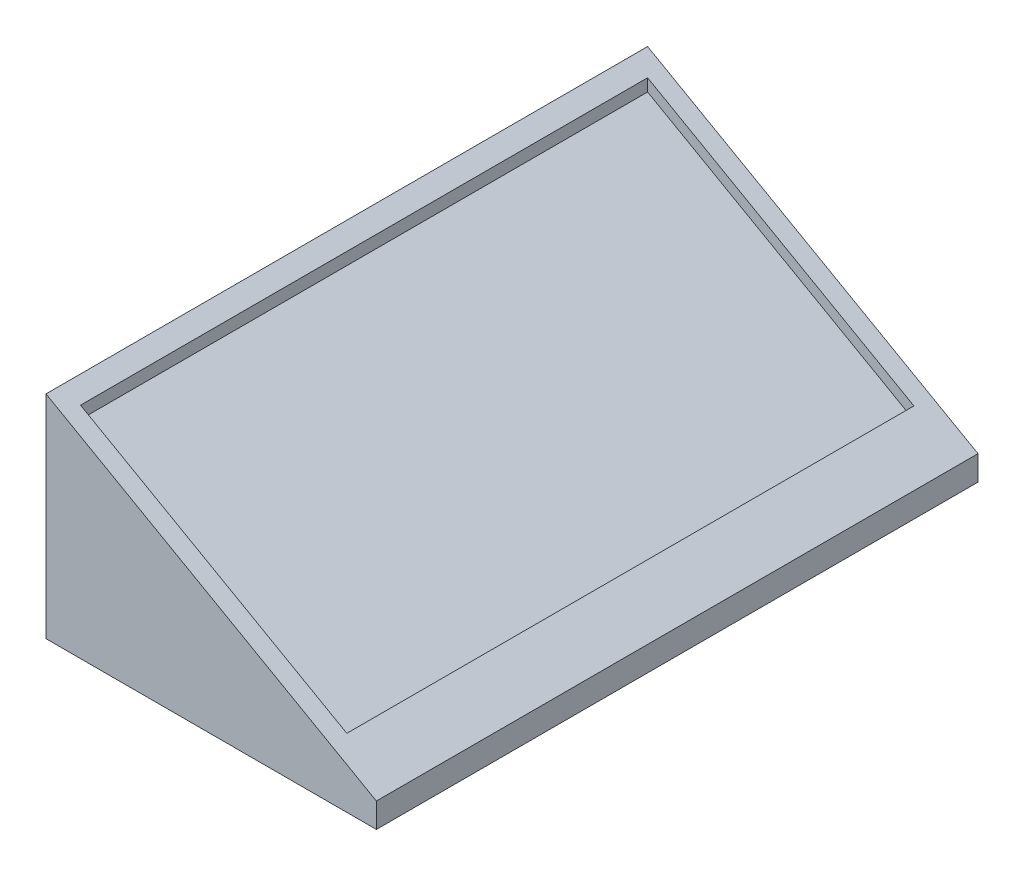
ISO-10303-21;
HEADER;
FILE_DESCRIPTION(('STEP AP214'),'2;1');
FILE_NAME('part.step','',(''),(''),'','','');
FILE_SCHEMA(('AUTOMOTIVE_DESIGN { 1 0 10303 214 1 1 1 1 }'));
ENDSEC;
DATA;
#1=APPLICATION_CONTEXT('core data for automotive mechanical design processes');
#2=APPLICATION_PROTOCOL_DEFINITION('international standard','automotive_design',2000,#1);
#3=PRODUCT_CONTEXT('',#1,'mechanical');
#4=PRODUCT('Part','Part','',(#3));
#5=PRODUCT_RELATED_PRODUCT_CATEGORY('part','',(#4));
#6=PRODUCT_DEFINITION_FORMATION('','',#4);
#7=PRODUCT_DEFINITION_CONTEXT('part definition',#1,'design');
#8=PRODUCT_DEFINITION('design','',#6,#7);
#9=PRODUCT_DEFINITION_SHAPE('','',#8);
#10=(LENGTH_UNIT() NAMED_UNIT(*) SI_UNIT(.MILLI.,.METRE.));
#11=(NAMED_UNIT(*) PLANE_ANGLE_UNIT() SI_UNIT($,.RADIAN.));
#12=(NAMED_UNIT(*) SI_UNIT($,.STERADIAN.) SOLID_ANGLE_UNIT());
#13=UNCERTAINTY_MEASURE_WITH_UNIT(LENGTH_MEASURE(1.E-05),#10,'distance_accuracy_value','');
#14=(GEOMETRIC_REPRESENTATION_CONTEXT(3) GLOBAL_UNCERTAINTY_ASSIGNED_CONTEXT((#13)) GLOBAL_UNIT_ASSIGNED_CONTEXT((#10,
#11,#12)) REPRESENTATION_CONTEXT('',''));
#15=CARTESIAN_POINT('',(0.,0.,0.));
#16=DIRECTION('',(0.,0.,1.));
#17=DIRECTION('',(1.,0.,0.));
#18=AXIS2_PLACEMENT_3D('',#15,#16,#17);
#19=CARTESIAN_POINT('',(63.5395062929943,122.,3.5));
#20=DIRECTION('',(0.,0.,-1.));
#21=DIRECTION('',(-1.,0.,0.));
#22=AXIS2_PLACEMENT_3D('',#19,#20,#21);
#23=PLANE('',#22);
#24=DIRECTION('',(0.999961324548832,-0.00879485113838183,0.));
#25=VECTOR('',#24,1.);
#26=CARTESIAN_POINT('',(62.4665759517816,0.0094366275986274,3.5));
#27=LINE('',#26,#25);
#28=CARTESIAN_POINT('',(57.4298631235469,0.0537354804278703,3.49999999999999));
#29=VERTEX_POINT('',#28);
#30=CARTESIAN_POINT('',(63.5395062929943,0.,3.5));
#31=VERTEX_POINT('',#30);
#32=EDGE_CURVE('E213',#29,#31,#27,.T.);
#33=ORIENTED_EDGE('',*,*,#32,.F.);
#34=DIRECTION('',(0.869836501992691,-0.493340105607803,0.));
#35=VECTOR('',#34,1.);
#36=CARTESIAN_POINT('',(9.722295067052,27.1117591542613,3.49999999999999));
#37=LINE('',#36,#35);
#38=CARTESIAN_POINT('',(3.5,30.6408220281117,3.49999999999999));
#39=VERTEX_POINT('',#38);
#40=EDGE_CURVE('E230',#39,#29,#37,.T.);
#41=ORIENTED_EDGE('',*,*,#40,.F.);
#42=DIRECTION('',(0.,-1.,0.));
#43=VECTOR('',#42,1.);
#44=CARTESIAN_POINT('',(3.5,122.,3.49999999999999));
#45=LINE('',#44,#43);
#46=CARTESIAN_POINT('',(3.5,0.,3.49999999999999));
#47=VERTEX_POINT('',#46);
#48=EDGE_CURVE('E251',#39,#47,#45,.T.);
#49=ORIENTED_EDGE('',*,*,#48,.T.);
#50=DIRECTION('',(1.,0.,0.));
#51=VECTOR('',#50,1.);
#52=CARTESIAN_POINT('',(63.5395062929943,0.,3.5));
#53=LINE('',#52,#51);
#54=EDGE_CURVE('E243',#47,#31,#53,.T.);
#55=ORIENTED_EDGE('',*,*,#54,.T.);
#56=EDGE_LOOP('',(#33,#41,#49,#55));
#57=FACE_BOUND('',#56,.T.);
#58=ADVANCED_FACE('F35',(#57),#23,.F.);
#59=CARTESIAN_POINT('',(63.5395062929943,122.,118.5));
#60=DIRECTION('',(0.,0.,1.));
#61=DIRECTION('',(1.,0.,0.));
#62=AXIS2_PLACEMENT_3D('',#59,#60,#61);
#63=PLANE('',#62);
#64=DIRECTION('',(-0.999961324548832,0.00879485113838183,0.));
#65=VECTOR('',#64,1.);
#66=CARTESIAN_POINT('',(63.5395062929943,0.,118.5));
#67=LINE('',#66,#65);
#68=CARTESIAN_POINT('',(63.5395062929943,0.,118.5));
#69=VERTEX_POINT('',#68);
#70=CARTESIAN_POINT('',(57.4298631235469,0.0537354804278703,118.5));
#71=VERTEX_POINT('',#70);
#72=EDGE_CURVE('E211',#69,#71,#67,.T.);
#73=ORIENTED_EDGE('',*,*,#72,.F.);
#74=DIRECTION('',(-1.,0.,0.));
#75=VECTOR('',#74,1.);
#76=CARTESIAN_POINT('',(63.5395062929943,0.,118.5));
#77=LINE('',#76,#75);
#78=CARTESIAN_POINT('',(3.5,0.,118.5));
#79=VERTEX_POINT('',#78);
#80=EDGE_CURVE('E237',#69,#79,#77,.T.);
#81=ORIENTED_EDGE('',*,*,#80,.T.);
#82=DIRECTION('',(0.,-1.,0.));
#83=VECTOR('',#82,1.);
#84=CARTESIAN_POINT('',(3.5,122.,118.5));
#85=LINE('',#84,#83);
#86=CARTESIAN_POINT('',(3.49999999999999,30.6408220281117,118.5));
#87=VERTEX_POINT('',#86);
#88=EDGE_CURVE('E246',#87,#79,#85,.T.);
#89=ORIENTED_EDGE('',*,*,#88,.F.);
#90=DIRECTION('',(-0.869836501992692,0.493340105607803,0.));
#91=VECTOR('',#90,1.);
#92=CARTESIAN_POINT('',(3.49999999999999,30.6408220281117,118.5));
#93=LINE('',#92,#91);
#94=EDGE_CURVE('E218',#71,#87,#93,.T.);
#95=ORIENTED_EDGE('',*,*,#94,.F.);
#96=EDGE_LOOP('',(#73,#81,#89,#95));
#97=FACE_BOUND('',#96,.T.);
#98=ADVANCED_FACE('F294',(#97),#63,.F.);
#99=CARTESIAN_POINT('',(3.5,122.,3.49999999999999));
#100=DIRECTION('',(-1.,0.,0.));
#101=DIRECTION('',(0.,0.,1.));
#102=AXIS2_PLACEMENT_3D('',#99,#100,#101);
#103=PLANE('',#102);
#104=DIRECTION('',(0.,0.,1.));
#105=VECTOR('',#104,1.);
#106=CARTESIAN_POINT('',(3.50000000000002,30.6408220281117,1.99999999999992));
#107=LINE('',#106,#105);
#108=EDGE_CURVE('E224',#39,#87,#107,.T.);
#109=ORIENTED_EDGE('',*,*,#108,.T.);
#110=ORIENTED_EDGE('',*,*,#88,.T.);
#111=DIRECTION('',(0.,0.,-1.));
#112=VECTOR('',#111,1.);
#113=CARTESIAN_POINT('',(3.5,0.,3.49999999999999));
#114=LINE('',#113,#112);
#115=EDGE_CURVE('E240',#79,#47,#114,.T.);
#116=ORIENTED_EDGE('',*,*,#115,.T.);
#117=ORIENTED_EDGE('',*,*,#48,.F.);
#118=EDGE_LOOP('',(#109,#110,#116,#117));
#119=FACE_BOUND('',#118,.T.);
#120=ADVANCED_FACE('F304',(#119),#103,.F.);
#121=CARTESIAN_POINT('',(0.,0.,122.));
#122=DIRECTION('',(0.,1.,0.));
#123=DIRECTION('',(0.,0.,1.));
#124=AXIS2_PLACEMENT_3D('',#121,#122,#123);
#125=PLANE('',#124);
#126=DIRECTION('',(0.,0.,-1.));
#127=VECTOR('',#126,1.);
#128=CARTESIAN_POINT('',(65.,0.,0.));
#129=LINE('',#128,#127);
#130=CARTESIAN_POINT('',(65.,0.,120.));
#131=VERTEX_POINT('',#130);
#132=CARTESIAN_POINT('',(65.,0.,2.));
#133=VERTEX_POINT('',#132);
#134=EDGE_CURVE('E50',#131,#133,#129,.T.);
#135=ORIENTED_EDGE('',*,*,#134,.F.);
#136=DIRECTION('',(-1.,0.,0.));
#137=VECTOR('',#136,1.);
#138=CARTESIAN_POINT('',(0.,0.,120.));
#139=LINE('',#138,#137);
#140=CARTESIAN_POINT('',(2.,0.,120.));
#141=VERTEX_POINT('',#140);
#142=EDGE_CURVE('E152',#131,#141,#139,.T.);
#143=ORIENTED_EDGE('',*,*,#142,.T.);
#144=DIRECTION('',(0.,0.,1.));
#145=VECTOR('',#144,1.);
#146=CARTESIAN_POINT('',(2.,0.,0.));
#147=LINE('',#146,#145);
#148=CARTESIAN_POINT('',(2.,0.,2.));
#149=VERTEX_POINT('',#148);
#150=EDGE_CURVE('E170',#149,#141,#147,.T.);
#151=ORIENTED_EDGE('',*,*,#150,.F.);
#152=DIRECTION('',(-1.,0.,0.));
#153=VECTOR('',#152,1.);
#154=CARTESIAN_POINT('',(0.,0.,1.99999999999999));
#155=LINE('',#154,#153);
#156=EDGE_CURVE('E55',#133,#149,#155,.T.);
#157=ORIENTED_EDGE('',*,*,#156,.F.);
#158=EDGE_LOOP('',(#135,#143,#151,#157));
#159=FACE_BOUND('',#158,.T.);
#160=ORIENTED_EDGE('',*,*,#80,.F.);
#161=DIRECTION('',(0.,0.,1.));
#162=VECTOR('',#161,1.);
#163=CARTESIAN_POINT('',(63.5395062929943,0.,3.5));
#164=LINE('',#163,#162);
#165=EDGE_CURVE('E235',#31,#69,#164,.T.);
#166=ORIENTED_EDGE('',*,*,#165,.F.);
#167=ORIENTED_EDGE('',*,*,#54,.F.);
#168=ORIENTED_EDGE('',*,*,#115,.F.);
#169=EDGE_LOOP('',(#160,#166,#167,#168));
#170=FACE_BOUND('',#169,.T.);
#171=ADVANCED_FACE('F327',(#159,#170),#125,.F.);
#172=CARTESIAN_POINT('',(3.50000000000002,30.6408220281117,1.99999999999992));
#173=DIRECTION('',(0.493340105607803,0.869836501992692,0.));
#174=DIRECTION('',(-0.869836501992692,0.493340105607803,0.));
#175=AXIS2_PLACEMENT_3D('',#172,#173,#174);
#176=PLANE('',#175);
#177=ORIENTED_EDGE('',*,*,#108,.F.);
#178=ORIENTED_EDGE('',*,*,#40,.T.);
#179=DIRECTION('',(0.,0.,1.));
#180=VECTOR('',#179,1.);
#181=CARTESIAN_POINT('',(57.4298631235469,0.0537354804278807,1.99999999999993));
#182=LINE('',#181,#180);
#183=EDGE_CURVE('E227',#29,#71,#182,.T.);
#184=ORIENTED_EDGE('',*,*,#183,.T.);
#185=ORIENTED_EDGE('',*,*,#94,.T.);
#186=EDGE_LOOP('',(#177,#178,#184,#185));
#187=FACE_BOUND('',#186,.T.);
#188=ADVANCED_FACE('F323',(#187),#176,.F.);
#189=CARTESIAN_POINT('',(63.5395062929943,0.,1.99999999999993));
#190=DIRECTION('',(0.00879485113838183,0.999961324548832,0.));
#191=DIRECTION('',(-0.999961324548832,0.00879485113838183,0.));
#192=AXIS2_PLACEMENT_3D('',#189,#190,#191);
#193=PLANE('',#192);
#194=ORIENTED_EDGE('',*,*,#183,.F.);
#195=ORIENTED_EDGE('',*,*,#32,.T.);
#196=ORIENTED_EDGE('',*,*,#165,.T.);
#197=ORIENTED_EDGE('',*,*,#72,.T.);
#198=EDGE_LOOP('',(#194,#195,#196,#197));
#199=FACE_BOUND('',#198,.T.);
#200=ADVANCED_FACE('F326',(#199),#193,.F.);
#201=CARTESIAN_POINT('',(67.,-5.,0.));
#202=DIRECTION('',(-1.,0.,0.));
#203=DIRECTION('',(0.,0.,1.));
#204=AXIS2_PLACEMENT_3D('',#201,#202,#203);
#205=PLANE('',#204);
#206=DIRECTION('',(0.,0.,-1.));
#207=VECTOR('',#206,1.);
#208=CARTESIAN_POINT('',(67.,0.,122.));
#209=LINE('',#208,#207);
#210=CARTESIAN_POINT('',(67.,0.,122.));
#211=VERTEX_POINT('',#210);
#212=CARTESIAN_POINT('',(67.,0.,0.));
#213=VERTEX_POINT('',#212);
#214=EDGE_CURVE('E265',#211,#213,#209,.T.);
#215=ORIENTED_EDGE('',*,*,#214,.F.);
#216=DIRECTION('',(0.,1.,0.));
#217=VECTOR('',#216,1.);
#218=CARTESIAN_POINT('',(67.,-5.,122.));
#219=LINE('',#218,#217);
#220=CARTESIAN_POINT('',(67.,-5.,122.));
#221=VERTEX_POINT('',#220);
#222=EDGE_CURVE('E154',#221,#211,#219,.T.);
#223=ORIENTED_EDGE('',*,*,#222,.F.);
#224=DIRECTION('',(0.,0.,1.));
#225=VECTOR('',#224,1.);
#226=CARTESIAN_POINT('',(67.,-5.,0.));
#227=LINE('',#226,#225);
#228=CARTESIAN_POINT('',(67.,-5.,0.));
#229=VERTEX_POINT('',#228);
#230=EDGE_CURVE('E180',#229,#221,#227,.T.);
#231=ORIENTED_EDGE('',*,*,#230,.F.);
#232=DIRECTION('',(0.,1.,0.));
#233=VECTOR('',#232,1.);
#234=CARTESIAN_POINT('',(67.,-5.,0.));
#235=LINE('',#234,#233);
#236=EDGE_CURVE('E194',#229,#213,#235,.T.);
#237=ORIENTED_EDGE('',*,*,#236,.T.);
#238=EDGE_LOOP('',(#215,#223,#231,#237));
#239=FACE_BOUND('',#238,.T.);
#240=ADVANCED_FACE('F330',(#239),#205,.F.);
#241=CARTESIAN_POINT('',(0.,-5.,120.));
#242=DIRECTION('',(0.,0.,-1.));
#243=DIRECTION('',(-1.,0.,0.));
#244=AXIS2_PLACEMENT_3D('',#241,#242,#243);
#245=PLANE('',#244);
#246=ORIENTED_EDGE('',*,*,#142,.F.);
#247=DIRECTION('',(0.,1.,0.));
#248=VECTOR('',#247,1.);
#249=CARTESIAN_POINT('',(65.,-5.,120.));
#250=LINE('',#249,#248);
#251=CARTESIAN_POINT('',(65.,-5.,120.));
#252=VERTEX_POINT('',#251);
#253=EDGE_CURVE('E146',#252,#131,#250,.T.);
#254=ORIENTED_EDGE('',*,*,#253,.F.);
#255=DIRECTION('',(-1.,0.,0.));
#256=VECTOR('',#255,1.);
#257=CARTESIAN_POINT('',(0.,-5.,120.));
#258=LINE('',#257,#256);
#259=CARTESIAN_POINT('',(2.,-5.,120.));
#260=VERTEX_POINT('',#259);
#261=EDGE_CURVE('E151',#252,#260,#258,.T.);
#262=ORIENTED_EDGE('',*,*,#261,.T.);
#263=DIRECTION('',(0.,1.,0.));
#264=VECTOR('',#263,1.);
#265=CARTESIAN_POINT('',(2.,-5.,120.));
#266=LINE('',#265,#264);
#267=EDGE_CURVE('E188',#260,#141,#266,.T.);
#268=ORIENTED_EDGE('',*,*,#267,.T.);
#269=EDGE_LOOP('',(#246,#254,#262,#268));
#270=FACE_BOUND('',#269,.T.);
#271=ADVANCED_FACE('F148',(#270),#245,.T.);
#272=CARTESIAN_POINT('',(65.,-5.,0.));
#273=DIRECTION('',(1.,0.,0.));
#274=DIRECTION('',(0.,0.,-1.));
#275=AXIS2_PLACEMENT_3D('',#272,#273,#274);
#276=PLANE('',#275);
#277=ORIENTED_EDGE('',*,*,#134,.T.);
#278=DIRECTION('',(0.,1.,0.));
#279=VECTOR('',#278,1.);
#280=CARTESIAN_POINT('',(65.,-5.,2.));
#281=LINE('',#280,#279);
#282=CARTESIAN_POINT('',(65.,-5.,2.));
#283=VERTEX_POINT('',#282);
#284=EDGE_CURVE('E155',#283,#133,#281,.T.);
#285=ORIENTED_EDGE('',*,*,#284,.F.);
#286=DIRECTION('',(0.,0.,-1.));
#287=VECTOR('',#286,1.);
#288=CARTESIAN_POINT('',(65.,-5.,0.));
#289=LINE('',#288,#287);
#290=EDGE_CURVE('E158',#252,#283,#289,.T.);
#291=ORIENTED_EDGE('',*,*,#290,.F.);
#292=ORIENTED_EDGE('',*,*,#253,.T.);
#293=EDGE_LOOP('',(#277,#285,#291,#292));
#294=FACE_BOUND('',#293,.T.);
#295=ADVANCED_FACE('F159',(#294),#276,.F.);
#296=CARTESIAN_POINT('',(0.,-5.,1.99999999999999));
#297=DIRECTION('',(0.,0.,-1.));
#298=DIRECTION('',(-1.,0.,0.));
#299=AXIS2_PLACEMENT_3D('',#296,#297,#298);
#300=PLANE('',#299);
#301=ORIENTED_EDGE('',*,*,#156,.T.);
#302=DIRECTION('',(0.,1.,0.));
#303=VECTOR('',#302,1.);
#304=CARTESIAN_POINT('',(2.,-5.,2.));
#305=LINE('',#304,#303);
#306=CARTESIAN_POINT('',(2.,-5.,2.));
#307=VERTEX_POINT('',#306);
#308=EDGE_CURVE('E199',#307,#149,#305,.T.);
#309=ORIENTED_EDGE('',*,*,#308,.F.);
#310=DIRECTION('',(-1.,0.,0.));
#311=VECTOR('',#310,1.);
#312=CARTESIAN_POINT('',(0.,-5.,1.99999999999999));
#313=LINE('',#312,#311);
#314=EDGE_CURVE('E163',#283,#307,#313,.T.);
#315=ORIENTED_EDGE('',*,*,#314,.F.);
#316=ORIENTED_EDGE('',*,*,#284,.T.);
#317=EDGE_LOOP('',(#301,#309,#315,#316));
#318=FACE_BOUND('',#317,.T.);
#319=ADVANCED_FACE('F337',(#318),#300,.F.);
#320=CARTESIAN_POINT('',(2.,-5.,0.));
#321=DIRECTION('',(-1.,0.,0.));
#322=DIRECTION('',(0.,0.,1.));
#323=AXIS2_PLACEMENT_3D('',#320,#321,#322);
#324=PLANE('',#323);
#325=ORIENTED_EDGE('',*,*,#150,.T.);
#326=ORIENTED_EDGE('',*,*,#267,.F.);
#327=DIRECTION('',(0.,0.,1.));
#328=VECTOR('',#327,1.);
#329=CARTESIAN_POINT('',(2.,-5.,0.));
#330=LINE('',#329,#328);
#331=EDGE_CURVE('E168',#307,#260,#330,.T.);
#332=ORIENTED_EDGE('',*,*,#331,.F.);
#333=ORIENTED_EDGE('',*,*,#308,.T.);
#334=EDGE_LOOP('',(#325,#326,#332,#333));
#335=FACE_BOUND('',#334,.T.);
#336=ADVANCED_FACE('F320',(#335),#324,.F.);
#337=CARTESIAN_POINT('',(0.,-5.,0.));
#338=DIRECTION('',(0.,-1.,0.));
#339=DIRECTION('',(0.,0.,-1.));
#340=AXIS2_PLACEMENT_3D('',#337,#338,#339);
#341=PLANE('',#340);
#342=ORIENTED_EDGE('',*,*,#261,.F.);
#343=ORIENTED_EDGE('',*,*,#290,.T.);
#344=ORIENTED_EDGE('',*,*,#314,.T.);
#345=ORIENTED_EDGE('',*,*,#331,.T.);
#346=EDGE_LOOP('',(#342,#343,#344,#345));
#347=FACE_BOUND('',#346,.T.);
#348=DIRECTION('',(1.,0.,0.));
#349=VECTOR('',#348,1.);
#350=CARTESIAN_POINT('',(0.,-5.,0.));
#351=LINE('',#350,#349);
#352=CARTESIAN_POINT('',(0.,-5.,0.));
#353=VERTEX_POINT('',#352);
#354=EDGE_CURVE('E177',#353,#229,#351,.T.);
#355=ORIENTED_EDGE('',*,*,#354,.T.);
#356=ORIENTED_EDGE('',*,*,#230,.T.);
#357=DIRECTION('',(-1.,0.,0.));
#358=VECTOR('',#357,1.);
#359=CARTESIAN_POINT('',(0.,-5.,122.));
#360=LINE('',#359,#358);
#361=CARTESIAN_POINT('',(0.,-5.,122.));
#362=VERTEX_POINT('',#361);
#363=EDGE_CURVE('E182',#221,#362,#360,.T.);
#364=ORIENTED_EDGE('',*,*,#363,.T.);
#365=DIRECTION('',(0.,0.,-1.));
#366=VECTOR('',#365,1.);
#367=CARTESIAN_POINT('',(0.,-5.,0.));
#368=LINE('',#367,#366);
#369=EDGE_CURVE('E185',#362,#353,#368,.T.);
#370=ORIENTED_EDGE('',*,*,#369,.T.);
#371=EDGE_LOOP('',(#355,#356,#364,#370));
#372=FACE_BOUND('',#371,.T.);
#373=ADVANCED_FACE('F165',(#347,#372),#341,.T.);
#374=CARTESIAN_POINT('',(3.50000000000002,33.5149253731343,1.99999999999992));
#375=DIRECTION('',(-0.493340105607803,-0.869836501992691,0.));
#376=DIRECTION('',(0.869836501992692,-0.493340105607803,0.));
#377=AXIS2_PLACEMENT_3D('',#374,#375,#376);
#378=PLANE('',#377);
#379=DIRECTION('',(0.,0.,-1.));
#380=VECTOR('',#379,1.);
#381=CARTESIAN_POINT('',(56.4298631235469,3.49500300455503,120.));
#382=LINE('',#381,#380);
#383=CARTESIAN_POINT('',(56.4298631235469,3.49500300455503,118.5));
#384=VERTEX_POINT('',#383);
#385=CARTESIAN_POINT('',(56.4298631235469,3.49500300455503,3.49999999999999));
#386=VERTEX_POINT('',#385);
#387=EDGE_CURVE('E204',#384,#386,#382,.T.);
#388=ORIENTED_EDGE('',*,*,#387,.T.);
#389=DIRECTION('',(-0.869836501992691,0.493340105607803,0.));
#390=VECTOR('',#389,1.);
#391=CARTESIAN_POINT('',(10.9556453310715,29.286350409243,3.49999999999999));
#392=LINE('',#391,#390);
#393=CARTESIAN_POINT('',(3.5,33.5149253731344,3.49999999999999));
#394=VERTEX_POINT('',#393);
#395=EDGE_CURVE('E233',#386,#394,#392,.T.);
#396=ORIENTED_EDGE('',*,*,#395,.T.);
#397=DIRECTION('',(0.,0.,1.));
#398=VECTOR('',#397,1.);
#399=CARTESIAN_POINT('',(3.50000000000002,33.5149253731343,1.99999999999992));
#400=LINE('',#399,#398);
#401=CARTESIAN_POINT('',(3.5,33.5149253731344,118.5));
#402=VERTEX_POINT('',#401);
#403=EDGE_CURVE('E221',#394,#402,#400,.T.);
#404=ORIENTED_EDGE('',*,*,#403,.T.);
#405=DIRECTION('',(0.869836501992692,-0.493340105607803,0.));
#406=VECTOR('',#405,1.);
#407=CARTESIAN_POINT('',(3.49999999999999,33.5149253731343,118.5));
#408=LINE('',#407,#406);
#409=EDGE_CURVE('E215',#402,#384,#408,.T.);
#410=ORIENTED_EDGE('',*,*,#409,.T.);
#411=EDGE_LOOP('',(#388,#396,#404,#410));
#412=FACE_BOUND('',#411,.T.);
#413=ADVANCED_FACE('F289',(#412),#378,.F.);
#414=DIRECTION('',(-0.493340105607803,-0.869836501992692,0.));
#415=VECTOR('',#414,1.);
#416=CARTESIAN_POINT('',(57.5026762029336,5.38654185505261,3.49999999999999));
#417=LINE('',#416,#415);
#418=CARTESIAN_POINT('',(57.5026762029336,5.38654185505261,3.49999999999999));
#419=VERTEX_POINT('',#418);
#420=EDGE_CURVE('E197',#419,#386,#417,.T.);
#421=ORIENTED_EDGE('',*,*,#420,.F.);
#422=DIRECTION('',(0.869836501992695,-0.493340105607797,0.));
#423=VECTOR('',#422,1.);
#424=CARTESIAN_POINT('',(67.,0.,3.5));
#425=LINE('',#424,#423);
#426=CARTESIAN_POINT('',(3.5,36.0149253731344,3.49999999999999));
#427=VERTEX_POINT('',#426);
#428=EDGE_CURVE('E11',#427,#419,#425,.T.);
#429=ORIENTED_EDGE('',*,*,#428,.F.);
#430=EDGE_CURVE('E247',#427,#394,#45,.T.);
#431=ORIENTED_EDGE('',*,*,#430,.T.);
#432=ORIENTED_EDGE('',*,*,#395,.F.);
#433=EDGE_LOOP('',(#421,#429,#431,#432));
#434=FACE_BOUND('',#433,.T.);
#435=ADVANCED_FACE('F284',(#434),#23,.F.);
#436=ORIENTED_EDGE('',*,*,#403,.F.);
#437=ORIENTED_EDGE('',*,*,#430,.F.);
#438=DIRECTION('',(0.,0.,-1.));
#439=VECTOR('',#438,1.);
#440=CARTESIAN_POINT('',(3.5,36.0149253731343,122.));
#441=LINE('',#440,#439);
#442=CARTESIAN_POINT('',(3.49999999999999,36.0149253731343,118.5));
#443=VERTEX_POINT('',#442);
#444=EDGE_CURVE('E43',#443,#427,#441,.T.);
#445=ORIENTED_EDGE('',*,*,#444,.F.);
#446=EDGE_CURVE('E252',#443,#402,#85,.T.);
#447=ORIENTED_EDGE('',*,*,#446,.T.);
#448=EDGE_LOOP('',(#436,#437,#445,#447));
#449=FACE_BOUND('',#448,.T.);
#450=ADVANCED_FACE('F280',(#449),#103,.F.);
#451=DIRECTION('',(0.493340105607803,0.869836501992692,0.));
#452=VECTOR('',#451,1.);
#453=CARTESIAN_POINT('',(109.01372408547,96.2086525953121,118.5));
#454=LINE('',#453,#452);
#455=CARTESIAN_POINT('',(57.5026762029336,5.38654185505261,118.5));
#456=VERTEX_POINT('',#455);
#457=EDGE_CURVE('E209',#384,#456,#454,.T.);
#458=ORIENTED_EDGE('',*,*,#457,.F.);
#459=ORIENTED_EDGE('',*,*,#409,.F.);
#460=ORIENTED_EDGE('',*,*,#446,.F.);
#461=DIRECTION('',(-0.869836501992695,0.493340105607797,0.));
#462=VECTOR('',#461,1.);
#463=CARTESIAN_POINT('',(67.,0.,118.5));
#464=LINE('',#463,#462);
#465=EDGE_CURVE('E268',#456,#443,#464,.T.);
#466=ORIENTED_EDGE('',*,*,#465,.F.);
#467=EDGE_LOOP('',(#458,#459,#460,#466));
#468=FACE_BOUND('',#467,.T.);
#469=ADVANCED_FACE('F291',(#468),#63,.F.);
#470=CARTESIAN_POINT('',(57.5026762029336,5.38654185505261,120.));
#471=DIRECTION('',(0.869836501992692,-0.493340105607803,0.));
#472=DIRECTION('',(0.493340105607803,0.869836501992692,0.));
#473=AXIS2_PLACEMENT_3D('',#470,#471,#472);
#474=PLANE('',#473);
#475=ORIENTED_EDGE('',*,*,#387,.F.);
#476=ORIENTED_EDGE('',*,*,#457,.T.);
#477=DIRECTION('',(0.,0.,-1.));
#478=VECTOR('',#477,1.);
#479=CARTESIAN_POINT('',(57.5026762029336,5.38654185505261,120.));
#480=LINE('',#479,#478);
#481=EDGE_CURVE('E207',#456,#419,#480,.T.);
#482=ORIENTED_EDGE('',*,*,#481,.T.);
#483=ORIENTED_EDGE('',*,*,#420,.T.);
#484=EDGE_LOOP('',(#475,#476,#482,#483));
#485=FACE_BOUND('',#484,.T.);
#486=ADVANCED_FACE('F286',(#485),#474,.F.);
#487=CARTESIAN_POINT('',(0.,0.,122.));
#488=DIRECTION('',(0.,0.,1.));
#489=DIRECTION('',(1.,0.,0.));
#490=AXIS2_PLACEMENT_3D('',#487,#488,#489);
#491=PLANE('',#490);
#492=DIRECTION('',(0.,-1.,0.));
#493=VECTOR('',#492,1.);
#494=CARTESIAN_POINT('',(0.,38.,122.));
#495=LINE('',#494,#493);
#496=CARTESIAN_POINT('',(0.,38.,122.));
#497=VERTEX_POINT('',#496);
#498=EDGE_CURVE('E255',#497,#362,#495,.T.);
#499=ORIENTED_EDGE('',*,*,#498,.T.);
#500=ORIENTED_EDGE('',*,*,#363,.F.);
#501=ORIENTED_EDGE('',*,*,#222,.T.);
#502=DIRECTION('',(-0.869836501992695,0.493340105607797,0.));
#503=VECTOR('',#502,1.);
#504=CARTESIAN_POINT('',(67.,0.,122.));
#505=LINE('',#504,#503);
#506=EDGE_CURVE('E257',#211,#497,#505,.T.);
#507=ORIENTED_EDGE('',*,*,#506,.T.);
#508=EDGE_LOOP('',(#499,#500,#501,#507));
#509=FACE_BOUND('',#508,.T.);
#510=ADVANCED_FACE('F300',(#509),#491,.T.);
#511=CARTESIAN_POINT('',(0.,0.,0.));
#512=DIRECTION('',(0.,0.,1.));
#513=DIRECTION('',(1.,0.,0.));
#514=AXIS2_PLACEMENT_3D('',#511,#512,#513);
#515=PLANE('',#514);
#516=DIRECTION('',(0.,-1.,0.));
#517=VECTOR('',#516,1.);
#518=CARTESIAN_POINT('',(0.,38.,0.));
#519=LINE('',#518,#517);
#520=CARTESIAN_POINT('',(0.,38.,0.));
#521=VERTEX_POINT('',#520);
#522=EDGE_CURVE('E250',#521,#353,#519,.T.);
#523=ORIENTED_EDGE('',*,*,#522,.F.);
#524=DIRECTION('',(-0.869836501992695,0.493340105607797,0.));
#525=VECTOR('',#524,1.);
#526=CARTESIAN_POINT('',(67.,0.,0.));
#527=LINE('',#526,#525);
#528=EDGE_CURVE('E258',#213,#521,#527,.T.);
#529=ORIENTED_EDGE('',*,*,#528,.F.);
#530=ORIENTED_EDGE('',*,*,#236,.F.);
#531=ORIENTED_EDGE('',*,*,#354,.F.);
#532=EDGE_LOOP('',(#523,#529,#530,#531));
#533=FACE_BOUND('',#532,.T.);
#534=ADVANCED_FACE('F360',(#533),#515,.F.);
#535=CARTESIAN_POINT('',(67.,0.,122.));
#536=DIRECTION('',(-0.493340105607797,-0.869836501992695,0.));
#537=DIRECTION('',(0.869836501992695,-0.493340105607797,0.));
#538=AXIS2_PLACEMENT_3D('',#535,#536,#537);
#539=PLANE('',#538);
#540=ORIENTED_EDGE('',*,*,#481,.F.);
#541=ORIENTED_EDGE('',*,*,#465,.T.);
#542=ORIENTED_EDGE('',*,*,#444,.T.);
#543=ORIENTED_EDGE('',*,*,#428,.T.);
#544=EDGE_LOOP('',(#540,#541,#542,#543));
#545=FACE_BOUND('',#544,.T.);
#546=ORIENTED_EDGE('',*,*,#528,.T.);
#547=DIRECTION('',(0.,0.,-1.));
#548=VECTOR('',#547,1.);
#549=CARTESIAN_POINT('',(0.,38.,122.));
#550=LINE('',#549,#548);
#551=EDGE_CURVE('E260',#497,#521,#550,.T.);
#552=ORIENTED_EDGE('',*,*,#551,.F.);
#553=ORIENTED_EDGE('',*,*,#506,.F.);
#554=ORIENTED_EDGE('',*,*,#214,.T.);
#555=EDGE_LOOP('',(#546,#552,#553,#554));
#556=FACE_BOUND('',#555,.T.);
#557=ADVANCED_FACE('F273',(#545,#556),#539,.F.);
#558=CARTESIAN_POINT('',(0.,38.,122.));
#559=DIRECTION('',(1.,0.,0.));
#560=DIRECTION('',(0.,1.,0.));
#561=AXIS2_PLACEMENT_3D('',#558,#559,#560);
#562=PLANE('',#561);
#563=ORIENTED_EDGE('',*,*,#522,.T.);
#564=ORIENTED_EDGE('',*,*,#369,.F.);
#565=ORIENTED_EDGE('',*,*,#498,.F.);
#566=ORIENTED_EDGE('',*,*,#551,.T.);
#567=EDGE_LOOP('',(#563,#564,#565,#566));
#568=FACE_BOUND('',#567,.T.);
#569=ADVANCED_FACE('F37',(#568),#562,.F.);
#570=CLOSED_SHELL('',(#58,#98,#120,#171,#188,#200,#240,#271,#295,#319,#336,#373,#413,#435,#450,
#469,#486,#510,#534,#557,#569));
#571=MANIFOLD_SOLID_BREP('B2',#570);
#572=ADVANCED_BREP_SHAPE_REPRESENTATION('',(#18,#571),#14);
#573=SHAPE_DEFINITION_REPRESENTATION(#9,#572);
ENDSEC;
END-ISO-10303-21;
